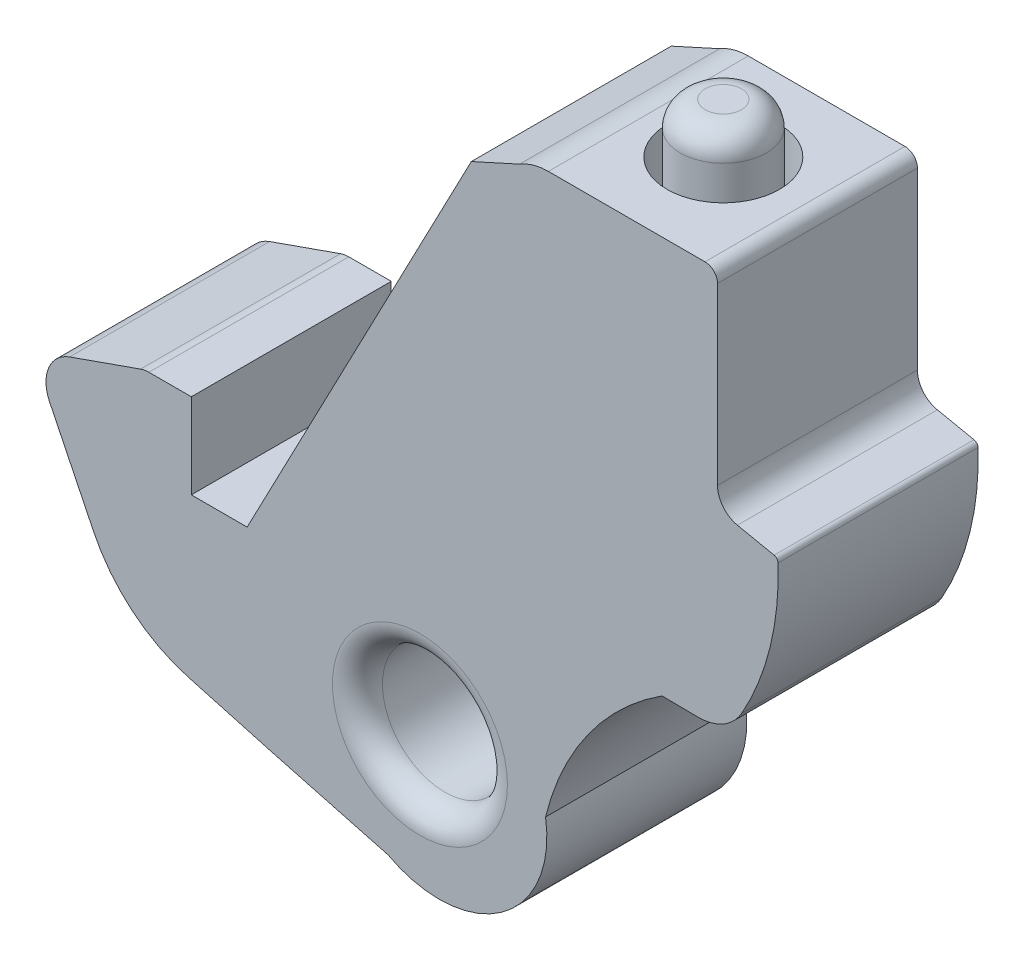
ISO-10303-21;
HEADER;
FILE_DESCRIPTION(('STEP AP214'),'2;1');
FILE_NAME('part.step','',(''),(''),'','','');
FILE_SCHEMA(('AUTOMOTIVE_DESIGN { 1 0 10303 214 1 1 1 1 }'));
ENDSEC;
DATA;
#1=APPLICATION_CONTEXT('core data for automotive mechanical design processes');
#2=APPLICATION_PROTOCOL_DEFINITION('international standard','automotive_design',2000,#1);
#3=PRODUCT_CONTEXT('',#1,'mechanical');
#4=PRODUCT('Part','Part','',(#3));
#5=PRODUCT_RELATED_PRODUCT_CATEGORY('part','',(#4));
#6=PRODUCT_DEFINITION_FORMATION('','',#4);
#7=PRODUCT_DEFINITION_CONTEXT('part definition',#1,'design');
#8=PRODUCT_DEFINITION('design','',#6,#7);
#9=PRODUCT_DEFINITION_SHAPE('','',#8);
#10=(LENGTH_UNIT() NAMED_UNIT(*) SI_UNIT(.MILLI.,.METRE.));
#11=(NAMED_UNIT(*) PLANE_ANGLE_UNIT() SI_UNIT($,.RADIAN.));
#12=(NAMED_UNIT(*) SI_UNIT($,.STERADIAN.) SOLID_ANGLE_UNIT());
#13=UNCERTAINTY_MEASURE_WITH_UNIT(LENGTH_MEASURE(1.E-05),#10,'distance_accuracy_value','');
#14=(GEOMETRIC_REPRESENTATION_CONTEXT(3) GLOBAL_UNCERTAINTY_ASSIGNED_CONTEXT((#13)) GLOBAL_UNIT_ASSIGNED_CONTEXT((#10,
#11,#12)) REPRESENTATION_CONTEXT('',''));
#15=CARTESIAN_POINT('',(0.,0.,0.));
#16=DIRECTION('',(0.,0.,1.));
#17=DIRECTION('',(1.,0.,0.));
#18=AXIS2_PLACEMENT_3D('',#15,#16,#17);
#19=CARTESIAN_POINT('',(-4.4880968427069,-2.72372084215497,8.));
#20=DIRECTION('',(0.,0.,1.));
#21=DIRECTION('',(1.,0.,0.));
#22=AXIS2_PLACEMENT_3D('',#19,#20,#21);
#23=PLANE('',#22);
#24=CARTESIAN_POINT('',(3.17902607404032,-5.85954847361733,8.));
#25=DIRECTION('',(0.,0.,1.));
#26=DIRECTION('',(1.,0.,0.));
#27=AXIS2_PLACEMENT_3D('',#24,#25,#26);
#28=CIRCLE('',#27,3.50000000000386);
#29=CARTESIAN_POINT('',(6.67902607404418,-5.85954847361733,8.));
#30=VERTEX_POINT('',#29);
#31=EDGE_CURVE('E237',#30,#30,#28,.F.);
#32=ORIENTED_EDGE('',*,*,#31,.T.);
#33=EDGE_LOOP('',(#32));
#34=FACE_BOUND('',#33,.T.);
#35=DIRECTION('',(0.,1.,0.));
#36=VECTOR('',#35,1.);
#37=CARTESIAN_POINT('',(15.0846568019224,16.2243711759693,8.));
#38=LINE('',#37,#36);
#39=CARTESIAN_POINT('',(15.0846568019225,8.72437117596931,8.));
#40=VERTEX_POINT('',#39);
#41=CARTESIAN_POINT('',(15.0846568019224,15.7243711759693,8.));
#42=VERTEX_POINT('',#41);
#43=EDGE_CURVE('E376',#40,#42,#38,.T.);
#44=ORIENTED_EDGE('',*,*,#43,.T.);
#45=CARTESIAN_POINT('',(14.5846568019224,15.7243711759693,8.));
#46=DIRECTION('',(0.,0.,1.));
#47=DIRECTION('',(1.,0.,0.));
#48=AXIS2_PLACEMENT_3D('',#45,#46,#47);
#49=CIRCLE('',#48,0.5);
#50=CARTESIAN_POINT('',(14.5846568019224,16.2243711759693,8.));
#51=VERTEX_POINT('',#50);
#52=EDGE_CURVE('E11',#42,#51,#49,.T.);
#53=ORIENTED_EDGE('',*,*,#52,.T.);
#54=DIRECTION('',(-1.,0.,0.));
#55=VECTOR('',#54,1.);
#56=CARTESIAN_POINT('',(13.7243034998767,16.2243711759693,8.));
#57=LINE('',#56,#55);
#58=CARTESIAN_POINT('',(8.31786754253232,16.2243711759693,8.));
#59=VERTEX_POINT('',#58);
#60=EDGE_CURVE('E253',#51,#59,#57,.T.);
#61=ORIENTED_EDGE('',*,*,#60,.T.);
#62=CARTESIAN_POINT('',(8.31786754253232,14.0167193890099,8.));
#63=DIRECTION('',(0.,0.,1.));
#64=DIRECTION('',(1.,0.,0.));
#65=AXIS2_PLACEMENT_3D('',#62,#63,#64);
#66=CIRCLE('',#65,2.20765178695946);
#67=CARTESIAN_POINT('',(7.16693978905321,15.9006227089116,8.));
#68=VERTEX_POINT('',#67);
#69=EDGE_CURVE('E379',#59,#68,#66,.T.);
#70=ORIENTED_EDGE('',*,*,#69,.T.);
#71=DIRECTION('',(-0.910716182900712,-0.413032727762289,0.));
#72=VECTOR('',#71,1.);
#73=CARTESIAN_POINT('',(5.23476253566495,15.0243316574609,8.));
#74=LINE('',#73,#72);
#75=CARTESIAN_POINT('',(5.23476253566495,15.0243316574609,8.));
#76=VERTEX_POINT('',#75);
#77=EDGE_CURVE('E386',#68,#76,#74,.T.);
#78=ORIENTED_EDGE('',*,*,#77,.T.);
#79=DIRECTION('',(-0.463424730649867,-0.88613628693452,0.));
#80=VECTOR('',#79,1.);
#81=CARTESIAN_POINT('',(-3.73592311044746,-2.1289395081834,8.));
#82=LINE('',#81,#80);
#83=CARTESIAN_POINT('',(-3.73592311044746,-2.1289395081834,8.));
#84=VERTEX_POINT('',#83);
#85=EDGE_CURVE('E388',#76,#84,#82,.T.);
#86=ORIENTED_EDGE('',*,*,#85,.T.);
#87=DIRECTION('',(-1.,0.,0.));
#88=VECTOR('',#87,1.);
#89=CARTESIAN_POINT('',(-3.73592311044746,-2.1289395081834,8.));
#90=LINE('',#89,#88);
#91=CARTESIAN_POINT('',(-5.96953612919984,-2.1289395081834,8.));
#92=VERTEX_POINT('',#91);
#93=EDGE_CURVE('E390',#84,#92,#90,.T.);
#94=ORIENTED_EDGE('',*,*,#93,.T.);
#95=DIRECTION('',(0.,1.,0.));
#96=VECTOR('',#95,1.);
#97=CARTESIAN_POINT('',(-5.96953612919984,-2.1289395081834,8.));
#98=LINE('',#97,#96);
#99=CARTESIAN_POINT('',(-5.96953612919984,1.2710604918166,8.));
#100=VERTEX_POINT('',#99);
#101=EDGE_CURVE('E392',#92,#100,#98,.T.);
#102=ORIENTED_EDGE('',*,*,#101,.T.);
#103=DIRECTION('',(-1.,0.,0.));
#104=VECTOR('',#103,1.);
#105=CARTESIAN_POINT('',(-5.96953612919984,1.2710604918166,8.));
#106=LINE('',#105,#104);
#107=CARTESIAN_POINT('',(-7.66797220054773,1.2710604918166,8.));
#108=VERTEX_POINT('',#107);
#109=EDGE_CURVE('E394',#100,#108,#106,.T.);
#110=ORIENTED_EDGE('',*,*,#109,.T.);
#111=CARTESIAN_POINT('',(-7.66797220054773,0.2710604918166,8.));
#112=DIRECTION('',(0.,0.,1.));
#113=DIRECTION('',(-1.,0.,0.));
#114=AXIS2_PLACEMENT_3D('',#111,#112,#113);
#115=CIRCLE('',#114,1.);
#116=CARTESIAN_POINT('',(-7.99980347927855,1.21439924457505,8.));
#117=VERTEX_POINT('',#116);
#118=EDGE_CURVE('E396',#108,#117,#115,.T.);
#119=ORIENTED_EDGE('',*,*,#118,.T.);
#120=DIRECTION('',(-0.943338752758449,-0.331831278730823,0.));
#121=VECTOR('',#120,1.);
#122=CARTESIAN_POINT('',(-7.99980347927855,1.21439924457505,8.));
#123=LINE('',#122,#121);
#124=CARTESIAN_POINT('',(-10.8390325666476,0.215664679800225,8.));
#125=VERTEX_POINT('',#124);
#126=EDGE_CURVE('E398',#117,#125,#123,.T.);
#127=ORIENTED_EDGE('',*,*,#126,.T.);
#128=CARTESIAN_POINT('',(-10.3692845071763,-1.1197475520644,8.));
#129=DIRECTION('',(0.,0.,1.));
#130=DIRECTION('',(1.,0.,0.));
#131=AXIS2_PLACEMENT_3D('',#128,#129,#130);
#132=CIRCLE('',#131,1.41562320848126);
#133=CARTESIAN_POINT('',(-11.6418752942782,-1.73982960871022,8.));
#134=VERTEX_POINT('',#133);
#135=EDGE_CURVE('E400',#125,#134,#132,.T.);
#136=ORIENTED_EDGE('',*,*,#135,.T.);
#137=DIRECTION('',(0.438027614220226,-0.898961517074305,0.));
#138=VECTOR('',#137,1.);
#139=CARTESIAN_POINT('',(-9.88186594515273,-5.35188652747633,8.));
#140=LINE('',#139,#138);
#141=CARTESIAN_POINT('',(-9.88186594515273,-5.35188652747633,8.));
#142=VERTEX_POINT('',#141);
#143=EDGE_CURVE('E211',#134,#142,#140,.T.);
#144=ORIENTED_EDGE('',*,*,#143,.T.);
#145=CARTESIAN_POINT('',(-4.4880968427069,-2.72372084215497,8.));
#146=DIRECTION('',(0.,0.,1.));
#147=DIRECTION('',(1.,0.,0.));
#148=AXIS2_PLACEMENT_3D('',#145,#146,#147);
#149=CIRCLE('',#148,6.);
#150=CARTESIAN_POINT('',(-6.08665836566715,-8.50685157362828,8.));
#151=VERTEX_POINT('',#150);
#152=EDGE_CURVE('E207',#142,#151,#149,.T.);
#153=ORIENTED_EDGE('',*,*,#152,.T.);
#154=DIRECTION('',(0.963855121912218,-0.266426920493374,0.));
#155=VECTOR('',#154,1.);
#156=CARTESIAN_POINT('',(-6.08665836566715,-8.50685157362828,8.));
#157=LINE('',#156,#155);
#158=CARTESIAN_POINT('',(-2.71392287900027,-9.43913642528591,8.));
#159=VERTEX_POINT('',#158);
#160=EDGE_CURVE('E196',#151,#159,#157,.T.);
#161=ORIENTED_EDGE('',*,*,#160,.T.);
#162=DIRECTION('',(0.966344454252272,-0.257251619500982,0.));
#163=VECTOR('',#162,1.);
#164=CARTESIAN_POINT('',(1.89917723923317,-10.6671948790947,8.));
#165=LINE('',#164,#163);
#166=CARTESIAN_POINT('',(1.89917723923317,-10.6671948790947,8.));
#167=VERTEX_POINT('',#166);
#168=EDGE_CURVE('E206',#159,#167,#165,.T.);
#169=ORIENTED_EDGE('',*,*,#168,.T.);
#170=CARTESIAN_POINT('',(3.94679920545169,-6.87359086183009,8.));
#171=DIRECTION('',(0.,0.,1.));
#172=DIRECTION('',(-1.,0.,0.));
#173=AXIS2_PLACEMENT_3D('',#170,#171,#172);
#174=CIRCLE('',#173,4.31093808310287);
#175=CARTESIAN_POINT('',(8.20546683586904,-6.20430977739535,8.));
#176=VERTEX_POINT('',#175);
#177=EDGE_CURVE('E346',#167,#176,#174,.T.);
#178=ORIENTED_EDGE('',*,*,#177,.T.);
#179=CARTESIAN_POINT('',(18.6947996724174,-8.76566144040033,8.));
#180=DIRECTION('',(0.,0.,-1.));
#181=DIRECTION('',(1.,0.,0.));
#182=AXIS2_PLACEMENT_3D('',#179,#180,#181);
#183=CIRCLE('',#182,10.7975286847255);
#184=CARTESIAN_POINT('',(12.8641188026736,0.322230850591779,8.));
#185=VERTEX_POINT('',#184);
#186=EDGE_CURVE('E406',#176,#185,#183,.T.);
#187=ORIENTED_EDGE('',*,*,#186,.T.);
#188=DIRECTION('',(0.999928839789039,-0.0119296000832889,0.));
#189=VECTOR('',#188,1.);
#190=CARTESIAN_POINT('',(12.8641188026736,0.322230850591779,8.));
#191=LINE('',#190,#189);
#192=CARTESIAN_POINT('',(14.2933429801124,0.30517956435244,8.));
#193=VERTEX_POINT('',#192);
#194=EDGE_CURVE('E410',#185,#193,#191,.T.);
#195=ORIENTED_EDGE('',*,*,#194,.T.);
#196=CARTESIAN_POINT('',(14.317202180279,2.30503724393052,8.));
#197=DIRECTION('',(0.,0.,1.));
#198=DIRECTION('',(-1.,0.,0.));
#199=AXIS2_PLACEMENT_3D('',#196,#197,#198);
#200=CIRCLE('',#199,2.);
#201=CARTESIAN_POINT('',(16.059003602843,1.32211923903179,8.));
#202=VERTEX_POINT('',#201);
#203=EDGE_CURVE('E412',#193,#202,#200,.T.);
#204=ORIENTED_EDGE('',*,*,#203,.T.);
#205=CARTESIAN_POINT('',(6.23522275854537,6.86578853620435,8.));
#206=DIRECTION('',(0.,0.,1.));
#207=DIRECTION('',(-1.,0.,0.));
#208=AXIS2_PLACEMENT_3D('',#205,#206,#207);
#209=CIRCLE('',#208,11.2800239074748);
#210=CARTESIAN_POINT('',(17.5085957845869,7.25308683070432,8.));
#211=VERTEX_POINT('',#210);
#212=EDGE_CURVE('E414',#202,#211,#209,.T.);
#213=ORIENTED_EDGE('',*,*,#212,.T.);
#214=CARTESIAN_POINT('',(17.3087137077666,7.24621985422135,8.));
#215=DIRECTION('',(0.,0.,1.));
#216=DIRECTION('',(-1.,0.,0.));
#217=AXIS2_PLACEMENT_3D('',#214,#215,#216);
#218=CIRCLE('',#217,0.200000000000002);
#219=CARTESIAN_POINT('',(17.3491687069256,7.44208560682514,8.));
#220=VERTEX_POINT('',#219);
#221=EDGE_CURVE('E416',#211,#220,#218,.T.);
#222=ORIENTED_EDGE('',*,*,#221,.T.);
#223=DIRECTION('',(-0.97932876301894,0.202274995794814,0.));
#224=VECTOR('',#223,1.);
#225=CARTESIAN_POINT('',(15.8823818061277,7.74504241295037,8.));
#226=LINE('',#225,#224);
#227=CARTESIAN_POINT('',(15.8823818061277,7.74504241295037,8.));
#228=VERTEX_POINT('',#227);
#229=EDGE_CURVE('E381',#220,#228,#226,.T.);
#230=ORIENTED_EDGE('',*,*,#229,.T.);
#231=CARTESIAN_POINT('',(16.0846568019225,8.72437117596931,8.));
#232=DIRECTION('',(0.,0.,-1.));
#233=DIRECTION('',(1.,0.,0.));
#234=AXIS2_PLACEMENT_3D('',#231,#232,#233);
#235=CIRCLE('',#234,0.999999999999999);
#236=EDGE_CURVE('E377',#228,#40,#235,.T.);
#237=ORIENTED_EDGE('',*,*,#236,.T.);
#238=EDGE_LOOP('',(#44,#53,#61,#70,#78,#86,#94,#102,#110,#119,#127,#136,#144,#153,#161,#169,
#178,#187,#195,#204,#213,#222,#230,#237));
#239=FACE_BOUND('',#238,.T.);
#240=ADVANCED_FACE('F35',(#34,#239),#23,.T.);
#241=CARTESIAN_POINT('',(-4.4880968427069,-2.72372084215497,0.));
#242=DIRECTION('',(0.,0.,1.));
#243=DIRECTION('',(1.,0.,0.));
#244=AXIS2_PLACEMENT_3D('',#241,#242,#243);
#245=PLANE('',#244);
#246=CARTESIAN_POINT('',(3.17902607404032,-5.85954847361733,0.));
#247=DIRECTION('',(0.,0.,1.));
#248=DIRECTION('',(1.,0.,0.));
#249=AXIS2_PLACEMENT_3D('',#246,#247,#248);
#250=CIRCLE('',#249,3.50000000000386);
#251=CARTESIAN_POINT('',(6.67902607404418,-5.85954847361733,0.));
#252=VERTEX_POINT('',#251);
#253=EDGE_CURVE('E240',#252,#252,#250,.T.);
#254=ORIENTED_EDGE('',*,*,#253,.T.);
#255=EDGE_LOOP('',(#254));
#256=FACE_BOUND('',#255,.T.);
#257=DIRECTION('',(-1.,0.,0.));
#258=VECTOR('',#257,1.);
#259=CARTESIAN_POINT('',(8.31786754253232,16.2243711759693,0.));
#260=LINE('',#259,#258);
#261=CARTESIAN_POINT('',(14.5846568019224,16.2243711759693,0.));
#262=VERTEX_POINT('',#261);
#263=CARTESIAN_POINT('',(8.31786754253232,16.2243711759693,0.));
#264=VERTEX_POINT('',#263);
#265=EDGE_CURVE('E251',#262,#264,#260,.T.);
#266=ORIENTED_EDGE('',*,*,#265,.F.);
#267=CARTESIAN_POINT('',(14.5846568019224,15.7243711759693,0.));
#268=DIRECTION('',(0.,0.,1.));
#269=DIRECTION('',(1.,0.,0.));
#270=AXIS2_PLACEMENT_3D('',#267,#268,#269);
#271=CIRCLE('',#270,0.5);
#272=CARTESIAN_POINT('',(15.0846568019224,15.7243711759693,0.));
#273=VERTEX_POINT('',#272);
#274=EDGE_CURVE('E57',#262,#273,#271,.F.);
#275=ORIENTED_EDGE('',*,*,#274,.T.);
#276=DIRECTION('',(0.,1.,0.));
#277=VECTOR('',#276,1.);
#278=CARTESIAN_POINT('',(15.0846568019224,16.2243711759693,0.));
#279=LINE('',#278,#277);
#280=CARTESIAN_POINT('',(15.0846568019225,8.72437117596931,0.));
#281=VERTEX_POINT('',#280);
#282=EDGE_CURVE('E260',#281,#273,#279,.T.);
#283=ORIENTED_EDGE('',*,*,#282,.F.);
#284=CARTESIAN_POINT('',(16.0846568019225,8.72437117596931,0.));
#285=DIRECTION('',(0.,0.,-1.));
#286=DIRECTION('',(1.,0.,0.));
#287=AXIS2_PLACEMENT_3D('',#284,#285,#286);
#288=CIRCLE('',#287,0.999999999999999);
#289=CARTESIAN_POINT('',(15.8823818061277,7.74504241295037,0.));
#290=VERTEX_POINT('',#289);
#291=EDGE_CURVE('E264',#290,#281,#288,.T.);
#292=ORIENTED_EDGE('',*,*,#291,.F.);
#293=DIRECTION('',(-0.97932876301894,0.202274995794814,0.));
#294=VECTOR('',#293,1.);
#295=CARTESIAN_POINT('',(15.8823818061277,7.74504241295037,0.));
#296=LINE('',#295,#294);
#297=CARTESIAN_POINT('',(17.3491687069256,7.44208560682514,0.));
#298=VERTEX_POINT('',#297);
#299=EDGE_CURVE('E367',#298,#290,#296,.T.);
#300=ORIENTED_EDGE('',*,*,#299,.F.);
#301=CARTESIAN_POINT('',(17.3087137077666,7.24621985422135,0.));
#302=DIRECTION('',(0.,0.,1.));
#303=DIRECTION('',(-1.,0.,0.));
#304=AXIS2_PLACEMENT_3D('',#301,#302,#303);
#305=CIRCLE('',#304,0.200000000000002);
#306=CARTESIAN_POINT('',(17.5085957845869,7.25308683070432,0.));
#307=VERTEX_POINT('',#306);
#308=EDGE_CURVE('E365',#307,#298,#305,.T.);
#309=ORIENTED_EDGE('',*,*,#308,.F.);
#310=CARTESIAN_POINT('',(6.23522275854537,6.86578853620435,0.));
#311=DIRECTION('',(0.,0.,1.));
#312=DIRECTION('',(-1.,0.,0.));
#313=AXIS2_PLACEMENT_3D('',#310,#311,#312);
#314=CIRCLE('',#313,11.2800239074748);
#315=CARTESIAN_POINT('',(16.059003602843,1.32211923903179,0.));
#316=VERTEX_POINT('',#315);
#317=EDGE_CURVE('E363',#316,#307,#314,.T.);
#318=ORIENTED_EDGE('',*,*,#317,.F.);
#319=CARTESIAN_POINT('',(14.317202180279,2.30503724393052,0.));
#320=DIRECTION('',(0.,0.,1.));
#321=DIRECTION('',(-1.,0.,0.));
#322=AXIS2_PLACEMENT_3D('',#319,#320,#321);
#323=CIRCLE('',#322,2.);
#324=CARTESIAN_POINT('',(14.2933429801124,0.30517956435244,0.));
#325=VERTEX_POINT('',#324);
#326=EDGE_CURVE('E361',#325,#316,#323,.T.);
#327=ORIENTED_EDGE('',*,*,#326,.F.);
#328=DIRECTION('',(0.999928839789039,-0.0119296000832889,0.));
#329=VECTOR('',#328,1.);
#330=CARTESIAN_POINT('',(12.8641188026736,0.322230850591779,0.));
#331=LINE('',#330,#329);
#332=CARTESIAN_POINT('',(12.8641188026736,0.322230850591779,0.));
#333=VERTEX_POINT('',#332);
#334=EDGE_CURVE('E354',#333,#325,#331,.T.);
#335=ORIENTED_EDGE('',*,*,#334,.F.);
#336=CARTESIAN_POINT('',(18.6947996724174,-8.76566144040033,0.));
#337=DIRECTION('',(0.,0.,-1.));
#338=DIRECTION('',(1.,0.,0.));
#339=AXIS2_PLACEMENT_3D('',#336,#337,#338);
#340=CIRCLE('',#339,10.7975286847255);
#341=CARTESIAN_POINT('',(8.20546683586904,-6.20430977739535,0.));
#342=VERTEX_POINT('',#341);
#343=EDGE_CURVE('E352',#342,#333,#340,.T.);
#344=ORIENTED_EDGE('',*,*,#343,.F.);
#345=CARTESIAN_POINT('',(3.94679920545169,-6.87359086183009,0.));
#346=DIRECTION('',(0.,0.,1.));
#347=DIRECTION('',(-1.,0.,0.));
#348=AXIS2_PLACEMENT_3D('',#345,#346,#347);
#349=CIRCLE('',#348,4.31093808310287);
#350=CARTESIAN_POINT('',(1.89917723923317,-10.6671948790947,0.));
#351=VERTEX_POINT('',#350);
#352=EDGE_CURVE('E345',#351,#342,#349,.T.);
#353=ORIENTED_EDGE('',*,*,#352,.F.);
#354=DIRECTION('',(0.966344454252272,-0.257251619500982,0.));
#355=VECTOR('',#354,1.);
#356=CARTESIAN_POINT('',(1.89917723923317,-10.6671948790947,0.));
#357=LINE('',#356,#355);
#358=CARTESIAN_POINT('',(-2.71392287900027,-9.43913642528591,0.));
#359=VERTEX_POINT('',#358);
#360=EDGE_CURVE('E350',#359,#351,#357,.T.);
#361=ORIENTED_EDGE('',*,*,#360,.F.);
#362=DIRECTION('',(0.963855121912218,-0.266426920493374,0.));
#363=VECTOR('',#362,1.);
#364=CARTESIAN_POINT('',(-6.08665836566715,-8.50685157362828,0.));
#365=LINE('',#364,#363);
#366=CARTESIAN_POINT('',(-6.08665836566715,-8.50685157362828,0.));
#367=VERTEX_POINT('',#366);
#368=EDGE_CURVE('E356',#367,#359,#365,.T.);
#369=ORIENTED_EDGE('',*,*,#368,.F.);
#370=CARTESIAN_POINT('',(-4.4880968427069,-2.72372084215497,0.));
#371=DIRECTION('',(0.,0.,1.));
#372=DIRECTION('',(1.,0.,0.));
#373=AXIS2_PLACEMENT_3D('',#370,#371,#372);
#374=CIRCLE('',#373,6.);
#375=CARTESIAN_POINT('',(-9.88186594515273,-5.35188652747633,0.));
#376=VERTEX_POINT('',#375);
#377=EDGE_CURVE('E219',#376,#367,#374,.T.);
#378=ORIENTED_EDGE('',*,*,#377,.F.);
#379=DIRECTION('',(0.438027614220226,-0.898961517074305,0.));
#380=VECTOR('',#379,1.);
#381=CARTESIAN_POINT('',(-9.88186594515273,-5.35188652747633,0.));
#382=LINE('',#381,#380);
#383=CARTESIAN_POINT('',(-11.6418752942782,-1.73982960871022,0.));
#384=VERTEX_POINT('',#383);
#385=EDGE_CURVE('E215',#384,#376,#382,.T.);
#386=ORIENTED_EDGE('',*,*,#385,.F.);
#387=CARTESIAN_POINT('',(-10.3692845071763,-1.1197475520644,0.));
#388=DIRECTION('',(0.,0.,1.));
#389=DIRECTION('',(1.,0.,0.));
#390=AXIS2_PLACEMENT_3D('',#387,#388,#389);
#391=CIRCLE('',#390,1.41562320848126);
#392=CARTESIAN_POINT('',(-10.8390325666476,0.215664679800225,0.));
#393=VERTEX_POINT('',#392);
#394=EDGE_CURVE('E281',#393,#384,#391,.T.);
#395=ORIENTED_EDGE('',*,*,#394,.F.);
#396=DIRECTION('',(-0.943338752758449,-0.331831278730823,0.));
#397=VECTOR('',#396,1.);
#398=CARTESIAN_POINT('',(-7.99980347927855,1.21439924457505,0.));
#399=LINE('',#398,#397);
#400=CARTESIAN_POINT('',(-7.99980347927855,1.21439924457505,0.));
#401=VERTEX_POINT('',#400);
#402=EDGE_CURVE('E279',#401,#393,#399,.T.);
#403=ORIENTED_EDGE('',*,*,#402,.F.);
#404=CARTESIAN_POINT('',(-7.66797220054773,0.2710604918166,0.));
#405=DIRECTION('',(0.,0.,1.));
#406=DIRECTION('',(-1.,0.,0.));
#407=AXIS2_PLACEMENT_3D('',#404,#405,#406);
#408=CIRCLE('',#407,1.);
#409=CARTESIAN_POINT('',(-7.66797220054773,1.2710604918166,0.));
#410=VERTEX_POINT('',#409);
#411=EDGE_CURVE('E277',#410,#401,#408,.T.);
#412=ORIENTED_EDGE('',*,*,#411,.F.);
#413=DIRECTION('',(-1.,0.,0.));
#414=VECTOR('',#413,1.);
#415=CARTESIAN_POINT('',(-5.96953612919984,1.2710604918166,0.));
#416=LINE('',#415,#414);
#417=CARTESIAN_POINT('',(-5.96953612919984,1.2710604918166,0.));
#418=VERTEX_POINT('',#417);
#419=EDGE_CURVE('E275',#418,#410,#416,.T.);
#420=ORIENTED_EDGE('',*,*,#419,.F.);
#421=DIRECTION('',(0.,1.,0.));
#422=VECTOR('',#421,1.);
#423=CARTESIAN_POINT('',(-5.96953612919984,-2.1289395081834,0.));
#424=LINE('',#423,#422);
#425=CARTESIAN_POINT('',(-5.96953612919984,-2.1289395081834,0.));
#426=VERTEX_POINT('',#425);
#427=EDGE_CURVE('E273',#426,#418,#424,.T.);
#428=ORIENTED_EDGE('',*,*,#427,.F.);
#429=DIRECTION('',(-1.,0.,0.));
#430=VECTOR('',#429,1.);
#431=CARTESIAN_POINT('',(-3.73592311044746,-2.1289395081834,0.));
#432=LINE('',#431,#430);
#433=CARTESIAN_POINT('',(-3.73592311044746,-2.1289395081834,0.));
#434=VERTEX_POINT('',#433);
#435=EDGE_CURVE('E271',#434,#426,#432,.T.);
#436=ORIENTED_EDGE('',*,*,#435,.F.);
#437=DIRECTION('',(-0.463424730649867,-0.88613628693452,0.));
#438=VECTOR('',#437,1.);
#439=CARTESIAN_POINT('',(-3.73592311044746,-2.1289395081834,0.));
#440=LINE('',#439,#438);
#441=CARTESIAN_POINT('',(5.23476253566495,15.0243316574609,0.));
#442=VERTEX_POINT('',#441);
#443=EDGE_CURVE('E269',#442,#434,#440,.T.);
#444=ORIENTED_EDGE('',*,*,#443,.F.);
#445=DIRECTION('',(-0.910716182900712,-0.413032727762289,0.));
#446=VECTOR('',#445,1.);
#447=CARTESIAN_POINT('',(5.23476253566495,15.0243316574609,0.));
#448=LINE('',#447,#446);
#449=CARTESIAN_POINT('',(7.16693978905321,15.9006227089116,0.));
#450=VERTEX_POINT('',#449);
#451=EDGE_CURVE('E262',#450,#442,#448,.T.);
#452=ORIENTED_EDGE('',*,*,#451,.F.);
#453=CARTESIAN_POINT('',(8.31786754253232,14.0167193890099,0.));
#454=DIRECTION('',(0.,0.,1.));
#455=DIRECTION('',(1.,0.,0.));
#456=AXIS2_PLACEMENT_3D('',#453,#454,#455);
#457=CIRCLE('',#456,2.20765178695946);
#458=EDGE_CURVE('E259',#264,#450,#457,.T.);
#459=ORIENTED_EDGE('',*,*,#458,.F.);
#460=EDGE_LOOP('',(#266,#275,#283,#292,#300,#309,#318,#327,#335,#344,#353,#361,#369,#378,#386,
#395,#403,#412,#420,#428,#436,#444,#452,#459));
#461=FACE_BOUND('',#460,.T.);
#462=ADVANCED_FACE('F257',(#256,#461),#245,.F.);
#463=CARTESIAN_POINT('',(-4.4880968427069,-2.72372084215497,8.));
#464=DIRECTION('',(0.,0.,-1.));
#465=DIRECTION('',(-1.,0.,0.));
#466=AXIS2_PLACEMENT_3D('',#463,#464,#465);
#467=CYLINDRICAL_SURFACE('',#466,6.);
#468=ORIENTED_EDGE('',*,*,#377,.T.);
#469=DIRECTION('',(0.,0.,-1.));
#470=VECTOR('',#469,1.);
#471=CARTESIAN_POINT('',(-6.08665836566715,-8.50685157362828,8.));
#472=LINE('',#471,#470);
#473=EDGE_CURVE('E200',#151,#367,#472,.T.);
#474=ORIENTED_EDGE('',*,*,#473,.F.);
#475=ORIENTED_EDGE('',*,*,#152,.F.);
#476=DIRECTION('',(0.,0.,-1.));
#477=VECTOR('',#476,1.);
#478=CARTESIAN_POINT('',(-9.88186594515273,-5.35188652747633,8.));
#479=LINE('',#478,#477);
#480=EDGE_CURVE('E284',#142,#376,#479,.T.);
#481=ORIENTED_EDGE('',*,*,#480,.T.);
#482=EDGE_LOOP('',(#468,#474,#475,#481));
#483=FACE_BOUND('',#482,.T.);
#484=ADVANCED_FACE('F217',(#483),#467,.T.);
#485=CARTESIAN_POINT('',(-6.08665836566715,-8.50685157362828,8.));
#486=DIRECTION('',(0.266426920493374,0.963855121912218,0.));
#487=DIRECTION('',(-0.963855121912218,0.266426920493374,0.));
#488=AXIS2_PLACEMENT_3D('',#485,#486,#487);
#489=PLANE('',#488);
#490=ORIENTED_EDGE('',*,*,#368,.T.);
#491=DIRECTION('',(0.,0.,-1.));
#492=VECTOR('',#491,1.);
#493=CARTESIAN_POINT('',(-2.71392287900027,-9.43913642528591,8.));
#494=LINE('',#493,#492);
#495=EDGE_CURVE('E203',#159,#359,#494,.T.);
#496=ORIENTED_EDGE('',*,*,#495,.F.);
#497=ORIENTED_EDGE('',*,*,#160,.F.);
#498=ORIENTED_EDGE('',*,*,#473,.T.);
#499=EDGE_LOOP('',(#490,#496,#497,#498));
#500=FACE_BOUND('',#499,.T.);
#501=ADVANCED_FACE('F198',(#500),#489,.F.);
#502=CARTESIAN_POINT('',(1.89917723923317,-10.6671948790947,8.));
#503=DIRECTION('',(0.257251619500982,0.966344454252272,0.));
#504=DIRECTION('',(-0.966344454252272,0.257251619500982,0.));
#505=AXIS2_PLACEMENT_3D('',#502,#503,#504);
#506=PLANE('',#505);
#507=ORIENTED_EDGE('',*,*,#360,.T.);
#508=DIRECTION('',(0.,0.,-1.));
#509=VECTOR('',#508,1.);
#510=CARTESIAN_POINT('',(1.89917723923317,-10.6671948790947,8.));
#511=LINE('',#510,#509);
#512=EDGE_CURVE('E225',#167,#351,#511,.T.);
#513=ORIENTED_EDGE('',*,*,#512,.F.);
#514=ORIENTED_EDGE('',*,*,#168,.F.);
#515=ORIENTED_EDGE('',*,*,#495,.T.);
#516=EDGE_LOOP('',(#507,#513,#514,#515));
#517=FACE_BOUND('',#516,.T.);
#518=ADVANCED_FACE('F404',(#517),#506,.F.);
#519=CARTESIAN_POINT('',(3.94679920545169,-6.87359086183009,8.));
#520=DIRECTION('',(0.,0.,-1.));
#521=DIRECTION('',(-1.,0.,0.));
#522=AXIS2_PLACEMENT_3D('',#519,#520,#521);
#523=CYLINDRICAL_SURFACE('',#522,4.31093808310287);
#524=ORIENTED_EDGE('',*,*,#352,.T.);
#525=DIRECTION('',(0.,0.,-1.));
#526=VECTOR('',#525,1.);
#527=CARTESIAN_POINT('',(8.20546683586904,-6.20430977739535,8.));
#528=LINE('',#527,#526);
#529=EDGE_CURVE('E336',#176,#342,#528,.T.);
#530=ORIENTED_EDGE('',*,*,#529,.F.);
#531=ORIENTED_EDGE('',*,*,#177,.F.);
#532=ORIENTED_EDGE('',*,*,#512,.T.);
#533=EDGE_LOOP('',(#524,#530,#531,#532));
#534=FACE_BOUND('',#533,.T.);
#535=ADVANCED_FACE('F343',(#534),#523,.T.);
#536=CARTESIAN_POINT('',(18.6947996724174,-8.76566144040033,8.));
#537=DIRECTION('',(0.,0.,-1.));
#538=DIRECTION('',(-1.,0.,0.));
#539=AXIS2_PLACEMENT_3D('',#536,#537,#538);
#540=CYLINDRICAL_SURFACE('',#539,10.7975286847255);
#541=ORIENTED_EDGE('',*,*,#343,.T.);
#542=DIRECTION('',(0.,0.,-1.));
#543=VECTOR('',#542,1.);
#544=CARTESIAN_POINT('',(12.8641188026736,0.322230850591779,8.));
#545=LINE('',#544,#543);
#546=EDGE_CURVE('E333',#185,#333,#545,.T.);
#547=ORIENTED_EDGE('',*,*,#546,.F.);
#548=ORIENTED_EDGE('',*,*,#186,.F.);
#549=ORIENTED_EDGE('',*,*,#529,.T.);
#550=EDGE_LOOP('',(#541,#547,#548,#549));
#551=FACE_BOUND('',#550,.T.);
#552=ADVANCED_FACE('F442',(#551),#540,.F.);
#553=CARTESIAN_POINT('',(12.8641188026736,0.322230850591779,8.));
#554=DIRECTION('',(0.0119296000832889,0.999928839789039,0.));
#555=DIRECTION('',(-0.999928839789039,0.0119296000832889,0.));
#556=AXIS2_PLACEMENT_3D('',#553,#554,#555);
#557=PLANE('',#556);
#558=ORIENTED_EDGE('',*,*,#334,.T.);
#559=DIRECTION('',(0.,0.,-1.));
#560=VECTOR('',#559,1.);
#561=CARTESIAN_POINT('',(14.2933429801124,0.30517956435244,8.));
#562=LINE('',#561,#560);
#563=EDGE_CURVE('E330',#193,#325,#562,.T.);
#564=ORIENTED_EDGE('',*,*,#563,.F.);
#565=ORIENTED_EDGE('',*,*,#194,.F.);
#566=ORIENTED_EDGE('',*,*,#546,.T.);
#567=EDGE_LOOP('',(#558,#564,#565,#566));
#568=FACE_BOUND('',#567,.T.);
#569=ADVANCED_FACE('F437',(#568),#557,.F.);
#570=CARTESIAN_POINT('',(14.317202180279,2.30503724393052,8.));
#571=DIRECTION('',(0.,0.,-1.));
#572=DIRECTION('',(-1.,0.,0.));
#573=AXIS2_PLACEMENT_3D('',#570,#571,#572);
#574=CYLINDRICAL_SURFACE('',#573,2.);
#575=ORIENTED_EDGE('',*,*,#326,.T.);
#576=DIRECTION('',(0.,0.,-1.));
#577=VECTOR('',#576,1.);
#578=CARTESIAN_POINT('',(16.059003602843,1.32211923903179,8.));
#579=LINE('',#578,#577);
#580=EDGE_CURVE('E327',#202,#316,#579,.T.);
#581=ORIENTED_EDGE('',*,*,#580,.F.);
#582=ORIENTED_EDGE('',*,*,#203,.F.);
#583=ORIENTED_EDGE('',*,*,#563,.T.);
#584=EDGE_LOOP('',(#575,#581,#582,#583));
#585=FACE_BOUND('',#584,.T.);
#586=ADVANCED_FACE('F434',(#585),#574,.T.);
#587=CARTESIAN_POINT('',(6.23522275854537,6.86578853620435,8.));
#588=DIRECTION('',(0.,0.,-1.));
#589=DIRECTION('',(-1.,0.,0.));
#590=AXIS2_PLACEMENT_3D('',#587,#588,#589);
#591=CYLINDRICAL_SURFACE('',#590,11.2800239074748);
#592=ORIENTED_EDGE('',*,*,#317,.T.);
#593=DIRECTION('',(0.,0.,-1.));
#594=VECTOR('',#593,1.);
#595=CARTESIAN_POINT('',(17.5085957845869,7.25308683070432,8.));
#596=LINE('',#595,#594);
#597=EDGE_CURVE('E324',#211,#307,#596,.T.);
#598=ORIENTED_EDGE('',*,*,#597,.F.);
#599=ORIENTED_EDGE('',*,*,#212,.F.);
#600=ORIENTED_EDGE('',*,*,#580,.T.);
#601=EDGE_LOOP('',(#592,#598,#599,#600));
#602=FACE_BOUND('',#601,.T.);
#603=ADVANCED_FACE('F430',(#602),#591,.T.);
#604=CARTESIAN_POINT('',(17.3087137077666,7.24621985422135,8.));
#605=DIRECTION('',(0.,0.,-1.));
#606=DIRECTION('',(-1.,0.,0.));
#607=AXIS2_PLACEMENT_3D('',#604,#605,#606);
#608=CYLINDRICAL_SURFACE('',#607,0.200000000000002);
#609=ORIENTED_EDGE('',*,*,#308,.T.);
#610=DIRECTION('',(0.,0.,-1.));
#611=VECTOR('',#610,1.);
#612=CARTESIAN_POINT('',(17.3491687069256,7.44208560682514,8.));
#613=LINE('',#612,#611);
#614=EDGE_CURVE('E321',#220,#298,#613,.T.);
#615=ORIENTED_EDGE('',*,*,#614,.F.);
#616=ORIENTED_EDGE('',*,*,#221,.F.);
#617=ORIENTED_EDGE('',*,*,#597,.T.);
#618=EDGE_LOOP('',(#609,#615,#616,#617));
#619=FACE_BOUND('',#618,.T.);
#620=ADVANCED_FACE('F426',(#619),#608,.T.);
#621=CARTESIAN_POINT('',(15.8823818061277,7.74504241295037,8.));
#622=DIRECTION('',(-0.202274995794814,-0.97932876301894,0.));
#623=DIRECTION('',(0.97932876301894,-0.202274995794814,0.));
#624=AXIS2_PLACEMENT_3D('',#621,#622,#623);
#625=PLANE('',#624);
#626=ORIENTED_EDGE('',*,*,#299,.T.);
#627=DIRECTION('',(0.,0.,-1.));
#628=VECTOR('',#627,1.);
#629=CARTESIAN_POINT('',(15.8823818061277,7.74504241295037,8.));
#630=LINE('',#629,#628);
#631=EDGE_CURVE('E318',#228,#290,#630,.T.);
#632=ORIENTED_EDGE('',*,*,#631,.F.);
#633=ORIENTED_EDGE('',*,*,#229,.F.);
#634=ORIENTED_EDGE('',*,*,#614,.T.);
#635=EDGE_LOOP('',(#626,#632,#633,#634));
#636=FACE_BOUND('',#635,.T.);
#637=ADVANCED_FACE('F421',(#636),#625,.F.);
#638=CARTESIAN_POINT('',(16.0846568019225,8.72437117596931,8.));
#639=DIRECTION('',(0.,0.,-1.));
#640=DIRECTION('',(-1.,0.,0.));
#641=AXIS2_PLACEMENT_3D('',#638,#639,#640);
#642=CYLINDRICAL_SURFACE('',#641,0.999999999999999);
#643=ORIENTED_EDGE('',*,*,#291,.T.);
#644=DIRECTION('',(0.,0.,-1.));
#645=VECTOR('',#644,1.);
#646=CARTESIAN_POINT('',(15.0846568019225,8.72437117596931,8.));
#647=LINE('',#646,#645);
#648=EDGE_CURVE('E315',#40,#281,#647,.T.);
#649=ORIENTED_EDGE('',*,*,#648,.F.);
#650=ORIENTED_EDGE('',*,*,#236,.F.);
#651=ORIENTED_EDGE('',*,*,#631,.T.);
#652=EDGE_LOOP('',(#643,#649,#650,#651));
#653=FACE_BOUND('',#652,.T.);
#654=ADVANCED_FACE('F371',(#653),#642,.F.);
#655=CARTESIAN_POINT('',(15.0846568019224,16.2243711759693,8.));
#656=DIRECTION('',(-1.,0.,0.));
#657=DIRECTION('',(0.,-1.,0.));
#658=AXIS2_PLACEMENT_3D('',#655,#656,#657);
#659=PLANE('',#658);
#660=ORIENTED_EDGE('',*,*,#282,.T.);
#661=DIRECTION('',(0.,0.,-1.));
#662=VECTOR('',#661,1.);
#663=CARTESIAN_POINT('',(15.0846568019224,15.7243711759693,8.));
#664=LINE('',#663,#662);
#665=EDGE_CURVE('E43',#273,#42,#664,.F.);
#666=ORIENTED_EDGE('',*,*,#665,.T.);
#667=ORIENTED_EDGE('',*,*,#43,.F.);
#668=ORIENTED_EDGE('',*,*,#648,.T.);
#669=EDGE_LOOP('',(#660,#666,#667,#668));
#670=FACE_BOUND('',#669,.T.);
#671=ADVANCED_FACE('F375',(#670),#659,.F.);
#672=CARTESIAN_POINT('',(8.31786754253232,16.2243711759693,8.));
#673=DIRECTION('',(0.,-1.,0.));
#674=DIRECTION('',(1.,0.,0.));
#675=AXIS2_PLACEMENT_3D('',#672,#673,#674);
#676=PLANE('',#675);
#677=CARTESIAN_POINT('',(11.3178675425323,16.2243711759693,4.));
#678=DIRECTION('',(0.,1.,0.));
#679=DIRECTION('',(0.,0.,1.));
#680=AXIS2_PLACEMENT_3D('',#677,#678,#679);
#681=CIRCLE('',#680,2.25);
#682=CARTESIAN_POINT('',(11.3178675425323,16.2243711759693,6.25));
#683=VERTEX_POINT('',#682);
#684=EDGE_CURVE('E795',#683,#683,#681,.T.);
#685=ORIENTED_EDGE('',*,*,#684,.F.);
#686=EDGE_LOOP('',(#685));
#687=FACE_BOUND('',#686,.T.);
#688=ORIENTED_EDGE('',*,*,#60,.F.);
#689=DIRECTION('',(0.,0.,-1.));
#690=VECTOR('',#689,1.);
#691=CARTESIAN_POINT('',(14.5846568019224,16.2243711759693,8.));
#692=LINE('',#691,#690);
#693=EDGE_CURVE('E243',#51,#262,#692,.T.);
#694=ORIENTED_EDGE('',*,*,#693,.T.);
#695=ORIENTED_EDGE('',*,*,#265,.T.);
#696=DIRECTION('',(0.,0.,-1.));
#697=VECTOR('',#696,1.);
#698=CARTESIAN_POINT('',(8.31786754253232,16.2243711759693,8.));
#699=LINE('',#698,#697);
#700=EDGE_CURVE('E313',#59,#264,#699,.T.);
#701=ORIENTED_EDGE('',*,*,#700,.F.);
#702=EDGE_LOOP('',(#688,#694,#695,#701));
#703=FACE_BOUND('',#702,.T.);
#704=ADVANCED_FACE('F249',(#687,#703),#676,.F.);
#705=CARTESIAN_POINT('',(8.31786754253232,14.0167193890099,8.));
#706=DIRECTION('',(0.,0.,-1.));
#707=DIRECTION('',(-1.,0.,0.));
#708=AXIS2_PLACEMENT_3D('',#705,#706,#707);
#709=CYLINDRICAL_SURFACE('',#708,2.20765178695946);
#710=ORIENTED_EDGE('',*,*,#458,.T.);
#711=DIRECTION('',(0.,0.,-1.));
#712=VECTOR('',#711,1.);
#713=CARTESIAN_POINT('',(7.16693978905321,15.9006227089116,8.));
#714=LINE('',#713,#712);
#715=EDGE_CURVE('E310',#68,#450,#714,.T.);
#716=ORIENTED_EDGE('',*,*,#715,.F.);
#717=ORIENTED_EDGE('',*,*,#69,.F.);
#718=ORIENTED_EDGE('',*,*,#700,.T.);
#719=EDGE_LOOP('',(#710,#716,#717,#718));
#720=FACE_BOUND('',#719,.T.);
#721=ADVANCED_FACE('F498',(#720),#709,.T.);
#722=CARTESIAN_POINT('',(5.23476253566495,15.0243316574609,8.));
#723=DIRECTION('',(0.413032727762289,-0.910716182900712,0.));
#724=DIRECTION('',(0.910716182900712,0.413032727762289,0.));
#725=AXIS2_PLACEMENT_3D('',#722,#723,#724);
#726=PLANE('',#725);
#727=ORIENTED_EDGE('',*,*,#451,.T.);
#728=DIRECTION('',(0.,0.,-1.));
#729=VECTOR('',#728,1.);
#730=CARTESIAN_POINT('',(5.23476253566495,15.0243316574609,8.));
#731=LINE('',#730,#729);
#732=EDGE_CURVE('E307',#76,#442,#731,.T.);
#733=ORIENTED_EDGE('',*,*,#732,.F.);
#734=ORIENTED_EDGE('',*,*,#77,.F.);
#735=ORIENTED_EDGE('',*,*,#715,.T.);
#736=EDGE_LOOP('',(#727,#733,#734,#735));
#737=FACE_BOUND('',#736,.T.);
#738=ADVANCED_FACE('F494',(#737),#726,.F.);
#739=CARTESIAN_POINT('',(-3.73592311044746,-2.1289395081834,8.));
#740=DIRECTION('',(0.88613628693452,-0.463424730649867,0.));
#741=DIRECTION('',(0.463424730649867,0.88613628693452,0.));
#742=AXIS2_PLACEMENT_3D('',#739,#740,#741);
#743=PLANE('',#742);
#744=ORIENTED_EDGE('',*,*,#443,.T.);
#745=DIRECTION('',(0.,0.,-1.));
#746=VECTOR('',#745,1.);
#747=CARTESIAN_POINT('',(-3.73592311044746,-2.1289395081834,8.));
#748=LINE('',#747,#746);
#749=EDGE_CURVE('E304',#84,#434,#748,.T.);
#750=ORIENTED_EDGE('',*,*,#749,.F.);
#751=ORIENTED_EDGE('',*,*,#85,.F.);
#752=ORIENTED_EDGE('',*,*,#732,.T.);
#753=EDGE_LOOP('',(#744,#750,#751,#752));
#754=FACE_BOUND('',#753,.T.);
#755=ADVANCED_FACE('F490',(#754),#743,.F.);
#756=CARTESIAN_POINT('',(-3.73592311044746,-2.1289395081834,8.));
#757=DIRECTION('',(0.,-1.,0.));
#758=DIRECTION('',(1.,0.,0.));
#759=AXIS2_PLACEMENT_3D('',#756,#757,#758);
#760=PLANE('',#759);
#761=ORIENTED_EDGE('',*,*,#435,.T.);
#762=DIRECTION('',(0.,0.,-1.));
#763=VECTOR('',#762,1.);
#764=CARTESIAN_POINT('',(-5.96953612919984,-2.1289395081834,8.));
#765=LINE('',#764,#763);
#766=EDGE_CURVE('E301',#92,#426,#765,.T.);
#767=ORIENTED_EDGE('',*,*,#766,.F.);
#768=ORIENTED_EDGE('',*,*,#93,.F.);
#769=ORIENTED_EDGE('',*,*,#749,.T.);
#770=EDGE_LOOP('',(#761,#767,#768,#769));
#771=FACE_BOUND('',#770,.T.);
#772=ADVANCED_FACE('F486',(#771),#760,.F.);
#773=CARTESIAN_POINT('',(-5.96953612919984,-2.1289395081834,8.));
#774=DIRECTION('',(-1.,0.,0.));
#775=DIRECTION('',(0.,0.,1.));
#776=AXIS2_PLACEMENT_3D('',#773,#774,#775);
#777=PLANE('',#776);
#778=ORIENTED_EDGE('',*,*,#427,.T.);
#779=DIRECTION('',(0.,0.,-1.));
#780=VECTOR('',#779,1.);
#781=CARTESIAN_POINT('',(-5.96953612919984,1.2710604918166,8.));
#782=LINE('',#781,#780);
#783=EDGE_CURVE('E298',#100,#418,#782,.T.);
#784=ORIENTED_EDGE('',*,*,#783,.F.);
#785=ORIENTED_EDGE('',*,*,#101,.F.);
#786=ORIENTED_EDGE('',*,*,#766,.T.);
#787=EDGE_LOOP('',(#778,#784,#785,#786));
#788=FACE_BOUND('',#787,.T.);
#789=ADVANCED_FACE('F482',(#788),#777,.F.);
#790=CARTESIAN_POINT('',(-5.96953612919984,1.2710604918166,8.));
#791=DIRECTION('',(0.,-1.,0.));
#792=DIRECTION('',(1.,0.,0.));
#793=AXIS2_PLACEMENT_3D('',#790,#791,#792);
#794=PLANE('',#793);
#795=ORIENTED_EDGE('',*,*,#419,.T.);
#796=DIRECTION('',(0.,0.,-1.));
#797=VECTOR('',#796,1.);
#798=CARTESIAN_POINT('',(-7.66797220054773,1.2710604918166,8.));
#799=LINE('',#798,#797);
#800=EDGE_CURVE('E295',#108,#410,#799,.T.);
#801=ORIENTED_EDGE('',*,*,#800,.F.);
#802=ORIENTED_EDGE('',*,*,#109,.F.);
#803=ORIENTED_EDGE('',*,*,#783,.T.);
#804=EDGE_LOOP('',(#795,#801,#802,#803));
#805=FACE_BOUND('',#804,.T.);
#806=ADVANCED_FACE('F478',(#805),#794,.F.);
#807=CARTESIAN_POINT('',(-7.66797220054773,0.2710604918166,8.));
#808=DIRECTION('',(0.,0.,-1.));
#809=DIRECTION('',(-1.,0.,0.));
#810=AXIS2_PLACEMENT_3D('',#807,#808,#809);
#811=CYLINDRICAL_SURFACE('',#810,1.);
#812=ORIENTED_EDGE('',*,*,#411,.T.);
#813=DIRECTION('',(0.,0.,-1.));
#814=VECTOR('',#813,1.);
#815=CARTESIAN_POINT('',(-7.99980347927855,1.21439924457505,8.));
#816=LINE('',#815,#814);
#817=EDGE_CURVE('E292',#117,#401,#816,.T.);
#818=ORIENTED_EDGE('',*,*,#817,.F.);
#819=ORIENTED_EDGE('',*,*,#118,.F.);
#820=ORIENTED_EDGE('',*,*,#800,.T.);
#821=EDGE_LOOP('',(#812,#818,#819,#820));
#822=FACE_BOUND('',#821,.T.);
#823=ADVANCED_FACE('F474',(#822),#811,.T.);
#824=CARTESIAN_POINT('',(-7.99980347927855,1.21439924457505,8.));
#825=DIRECTION('',(0.331831278730823,-0.943338752758449,0.));
#826=DIRECTION('',(0.943338752758449,0.331831278730823,0.));
#827=AXIS2_PLACEMENT_3D('',#824,#825,#826);
#828=PLANE('',#827);
#829=ORIENTED_EDGE('',*,*,#402,.T.);
#830=DIRECTION('',(0.,0.,-1.));
#831=VECTOR('',#830,1.);
#832=CARTESIAN_POINT('',(-10.8390325666476,0.215664679800225,8.));
#833=LINE('',#832,#831);
#834=EDGE_CURVE('E289',#125,#393,#833,.T.);
#835=ORIENTED_EDGE('',*,*,#834,.F.);
#836=ORIENTED_EDGE('',*,*,#126,.F.);
#837=ORIENTED_EDGE('',*,*,#817,.T.);
#838=EDGE_LOOP('',(#829,#835,#836,#837));
#839=FACE_BOUND('',#838,.T.);
#840=ADVANCED_FACE('F470',(#839),#828,.F.);
#841=CARTESIAN_POINT('',(-10.3692845071763,-1.1197475520644,8.));
#842=DIRECTION('',(0.,0.,-1.));
#843=DIRECTION('',(-1.,0.,0.));
#844=AXIS2_PLACEMENT_3D('',#841,#842,#843);
#845=CYLINDRICAL_SURFACE('',#844,1.41562320848126);
#846=ORIENTED_EDGE('',*,*,#394,.T.);
#847=DIRECTION('',(0.,0.,-1.));
#848=VECTOR('',#847,1.);
#849=CARTESIAN_POINT('',(-11.6418752942782,-1.73982960871022,8.));
#850=LINE('',#849,#848);
#851=EDGE_CURVE('E286',#134,#384,#850,.T.);
#852=ORIENTED_EDGE('',*,*,#851,.F.);
#853=ORIENTED_EDGE('',*,*,#135,.F.);
#854=ORIENTED_EDGE('',*,*,#834,.T.);
#855=EDGE_LOOP('',(#846,#852,#853,#854));
#856=FACE_BOUND('',#855,.T.);
#857=ADVANCED_FACE('F466',(#856),#845,.T.);
#858=CARTESIAN_POINT('',(-9.88186594515273,-5.35188652747633,8.));
#859=DIRECTION('',(0.898961517074306,0.438027614220226,0.));
#860=DIRECTION('',(-0.438027614220226,0.898961517074306,0.));
#861=AXIS2_PLACEMENT_3D('',#858,#859,#860);
#862=PLANE('',#861);
#863=ORIENTED_EDGE('',*,*,#385,.T.);
#864=ORIENTED_EDGE('',*,*,#480,.F.);
#865=ORIENTED_EDGE('',*,*,#143,.F.);
#866=ORIENTED_EDGE('',*,*,#851,.T.);
#867=EDGE_LOOP('',(#863,#864,#865,#866));
#868=FACE_BOUND('',#867,.T.);
#869=ADVANCED_FACE('F463',(#868),#862,.F.);
#870=CARTESIAN_POINT('',(3.17902607404032,-5.85954847361733,8.));
#871=DIRECTION('',(0.,0.,-1.));
#872=DIRECTION('',(-1.,0.,0.));
#873=AXIS2_PLACEMENT_3D('',#870,#871,#872);
#874=CYLINDRICAL_SURFACE('',#873,2.50000000000386);
#875=CARTESIAN_POINT('',(3.17902607404032,-5.85954847361733,7.));
#876=DIRECTION('',(0.,0.,1.));
#877=DIRECTION('',(1.,0.,0.));
#878=AXIS2_PLACEMENT_3D('',#875,#876,#877);
#879=CIRCLE('',#878,2.50000000000386);
#880=CARTESIAN_POINT('',(5.67902607404418,-5.85954847361733,7.));
#881=VERTEX_POINT('',#880);
#882=EDGE_CURVE('E234',#881,#881,#879,.T.);
#883=ORIENTED_EDGE('',*,*,#882,.T.);
#884=EDGE_LOOP('',(#883));
#885=FACE_BOUND('',#884,.T.);
#886=CARTESIAN_POINT('',(3.17902607404032,-5.85954847361733,1.));
#887=DIRECTION('',(0.,0.,1.));
#888=DIRECTION('',(1.,0.,0.));
#889=AXIS2_PLACEMENT_3D('',#886,#887,#888);
#890=CIRCLE('',#889,2.50000000000386);
#891=CARTESIAN_POINT('',(5.67902607404418,-5.85954847361733,1.));
#892=VERTEX_POINT('',#891);
#893=EDGE_CURVE('E231',#892,#892,#890,.F.);
#894=ORIENTED_EDGE('',*,*,#893,.T.);
#895=EDGE_LOOP('',(#894));
#896=FACE_BOUND('',#895,.T.);
#897=ADVANCED_FACE('F460',(#885,#896),#874,.F.);
#898=CARTESIAN_POINT('',(11.3178675425323,14.2243711759693,4.));
#899=DIRECTION('',(0.,1.,0.));
#900=DIRECTION('',(0.,0.,1.));
#901=AXIS2_PLACEMENT_3D('',#898,#899,#900);
#902=CYLINDRICAL_SURFACE('',#901,2.25);
#903=CARTESIAN_POINT('',(11.3178675425323,14.2243711759693,4.));
#904=DIRECTION('',(0.,1.,0.));
#905=DIRECTION('',(0.,0.,1.));
#906=AXIS2_PLACEMENT_3D('',#903,#904,#905);
#907=CIRCLE('',#906,2.25);
#908=CARTESIAN_POINT('',(11.3178675425323,14.2243711759693,6.25));
#909=VERTEX_POINT('',#908);
#910=EDGE_CURVE('E403',#909,#909,#907,.T.);
#911=ORIENTED_EDGE('',*,*,#910,.F.);
#912=EDGE_LOOP('',(#911));
#913=FACE_BOUND('',#912,.T.);
#914=ORIENTED_EDGE('',*,*,#684,.T.);
#915=EDGE_LOOP('',(#914));
#916=FACE_BOUND('',#915,.T.);
#917=ADVANCED_FACE('F594',(#913,#916),#902,.F.);
#918=CARTESIAN_POINT('',(11.3178675425323,14.2243711759693,4.));
#919=DIRECTION('',(0.,1.,0.));
#920=DIRECTION('',(0.,0.,1.));
#921=AXIS2_PLACEMENT_3D('',#918,#919,#920);
#922=PLANE('',#921);
#923=CARTESIAN_POINT('',(11.3178675425323,14.2243711759693,4.));
#924=DIRECTION('',(0.,1.,0.));
#925=DIRECTION('',(0.,0.,1.));
#926=AXIS2_PLACEMENT_3D('',#923,#924,#925);
#927=CIRCLE('',#926,1.725);
#928=CARTESIAN_POINT('',(11.3178675425323,14.2243711759693,5.725));
#929=VERTEX_POINT('',#928);
#930=EDGE_CURVE('E794',#929,#929,#927,.T.);
#931=ORIENTED_EDGE('',*,*,#930,.F.);
#932=EDGE_LOOP('',(#931));
#933=FACE_BOUND('',#932,.T.);
#934=ORIENTED_EDGE('',*,*,#910,.T.);
#935=EDGE_LOOP('',(#934));
#936=FACE_BOUND('',#935,.T.);
#937=ADVANCED_FACE('F602',(#933,#936),#922,.T.);
#938=CARTESIAN_POINT('',(11.3178675425323,18.2243711759693,4.));
#939=DIRECTION('',(0.,-1.,0.));
#940=DIRECTION('',(0.,0.,-1.));
#941=AXIS2_PLACEMENT_3D('',#938,#939,#940);
#942=CYLINDRICAL_SURFACE('',#941,1.725);
#943=CARTESIAN_POINT('',(11.3178675425323,17.2243711759693,4.));
#944=DIRECTION('',(0.,1.,0.));
#945=DIRECTION('',(0.,0.,1.));
#946=AXIS2_PLACEMENT_3D('',#943,#944,#945);
#947=CIRCLE('',#946,1.725);
#948=CARTESIAN_POINT('',(11.3178675425323,17.2243711759693,5.725));
#949=VERTEX_POINT('',#948);
#950=EDGE_CURVE('E223',#949,#949,#947,.F.);
#951=ORIENTED_EDGE('',*,*,#950,.T.);
#952=EDGE_LOOP('',(#951));
#953=FACE_BOUND('',#952,.T.);
#954=ORIENTED_EDGE('',*,*,#930,.T.);
#955=EDGE_LOOP('',(#954));
#956=FACE_BOUND('',#955,.T.);
#957=ADVANCED_FACE('F609',(#953,#956),#942,.T.);
#958=CARTESIAN_POINT('',(11.3178675425323,18.2243711759693,4.));
#959=DIRECTION('',(0.,1.,0.));
#960=DIRECTION('',(0.,0.,1.));
#961=AXIS2_PLACEMENT_3D('',#958,#959,#960);
#962=PLANE('',#961);
#963=CARTESIAN_POINT('',(11.3178675425323,18.2243711759693,4.));
#964=DIRECTION('',(0.,1.,0.));
#965=DIRECTION('',(0.,0.,1.));
#966=AXIS2_PLACEMENT_3D('',#963,#964,#965);
#967=CIRCLE('',#966,0.725000000000001);
#968=CARTESIAN_POINT('',(11.3178675425323,18.2243711759693,4.725));
#969=VERTEX_POINT('',#968);
#970=EDGE_CURVE('E220',#969,#969,#967,.T.);
#971=ORIENTED_EDGE('',*,*,#970,.T.);
#972=EDGE_LOOP('',(#971));
#973=FACE_BOUND('',#972,.T.);
#974=ADVANCED_FACE('F617',(#973),#962,.T.);
#975=CARTESIAN_POINT('',(11.3178675425323,17.2243711759693,4.));
#976=DIRECTION('',(0.,1.,0.));
#977=DIRECTION('',(0.,0.,1.));
#978=AXIS2_PLACEMENT_3D('',#975,#976,#977);
#979=DEGENERATE_TOROIDAL_SURFACE('',#978,0.725000000000001,1.,.T.);
#980=ORIENTED_EDGE('',*,*,#950,.F.);
#981=EDGE_LOOP('',(#980));
#982=FACE_BOUND('',#981,.T.);
#983=ORIENTED_EDGE('',*,*,#970,.F.);
#984=EDGE_LOOP('',(#983));
#985=FACE_BOUND('',#984,.T.);
#986=ADVANCED_FACE('F625',(#982,#985),#979,.T.);
#987=CARTESIAN_POINT('',(3.17902607404032,-5.85954847361733,7.));
#988=DIRECTION('',(0.,0.,1.));
#989=DIRECTION('',(1.,0.,0.));
#990=AXIS2_PLACEMENT_3D('',#987,#988,#989);
#991=TOROIDAL_SURFACE('',#990,3.50000000000386,1.);
#992=ORIENTED_EDGE('',*,*,#31,.F.);
#993=EDGE_LOOP('',(#992));
#994=FACE_BOUND('',#993,.T.);
#995=ORIENTED_EDGE('',*,*,#882,.F.);
#996=EDGE_LOOP('',(#995));
#997=FACE_BOUND('',#996,.T.);
#998=ADVANCED_FACE('F632',(#994,#997),#991,.T.);
#999=CARTESIAN_POINT('',(3.17902607404032,-5.85954847361733,1.));
#1000=DIRECTION('',(0.,0.,1.));
#1001=DIRECTION('',(1.,0.,0.));
#1002=AXIS2_PLACEMENT_3D('',#999,#1000,#1001);
#1003=TOROIDAL_SURFACE('',#1002,3.50000000000386,1.);
#1004=ORIENTED_EDGE('',*,*,#893,.F.);
#1005=EDGE_LOOP('',(#1004));
#1006=FACE_BOUND('',#1005,.T.);
#1007=ORIENTED_EDGE('',*,*,#253,.F.);
#1008=EDGE_LOOP('',(#1007));
#1009=FACE_BOUND('',#1008,.T.);
#1010=ADVANCED_FACE('F639',(#1006,#1009),#1003,.T.);
#1011=CARTESIAN_POINT('',(14.5846568019224,15.7243711759693,8.));
#1012=DIRECTION('',(0.,0.,-1.));
#1013=DIRECTION('',(-1.,0.,0.));
#1014=AXIS2_PLACEMENT_3D('',#1011,#1012,#1013);
#1015=CYLINDRICAL_SURFACE('',#1014,0.5);
#1016=ORIENTED_EDGE('',*,*,#52,.F.);
#1017=ORIENTED_EDGE('',*,*,#665,.F.);
#1018=ORIENTED_EDGE('',*,*,#274,.F.);
#1019=ORIENTED_EDGE('',*,*,#693,.F.);
#1020=EDGE_LOOP('',(#1016,#1017,#1018,#1019));
#1021=FACE_BOUND('',#1020,.T.);
#1022=ADVANCED_FACE('F37',(#1021),#1015,.T.);
#1023=CLOSED_SHELL('',(#240,#462,#484,#501,#518,#535,#552,#569,#586,#603,#620,#637,#654,#671,
#704,#721,#738,#755,#772,#789,#806,#823,#840,#857,#869,#897,#917,#937,#957,#974,#986,#998,#1010,#1022));
#1024=MANIFOLD_SOLID_BREP('B2',#1023);
#1025=ADVANCED_BREP_SHAPE_REPRESENTATION('',(#18,#1024),#14);
#1026=SHAPE_DEFINITION_REPRESENTATION(#9,#1025);
ENDSEC;
END-ISO-10303-21;
